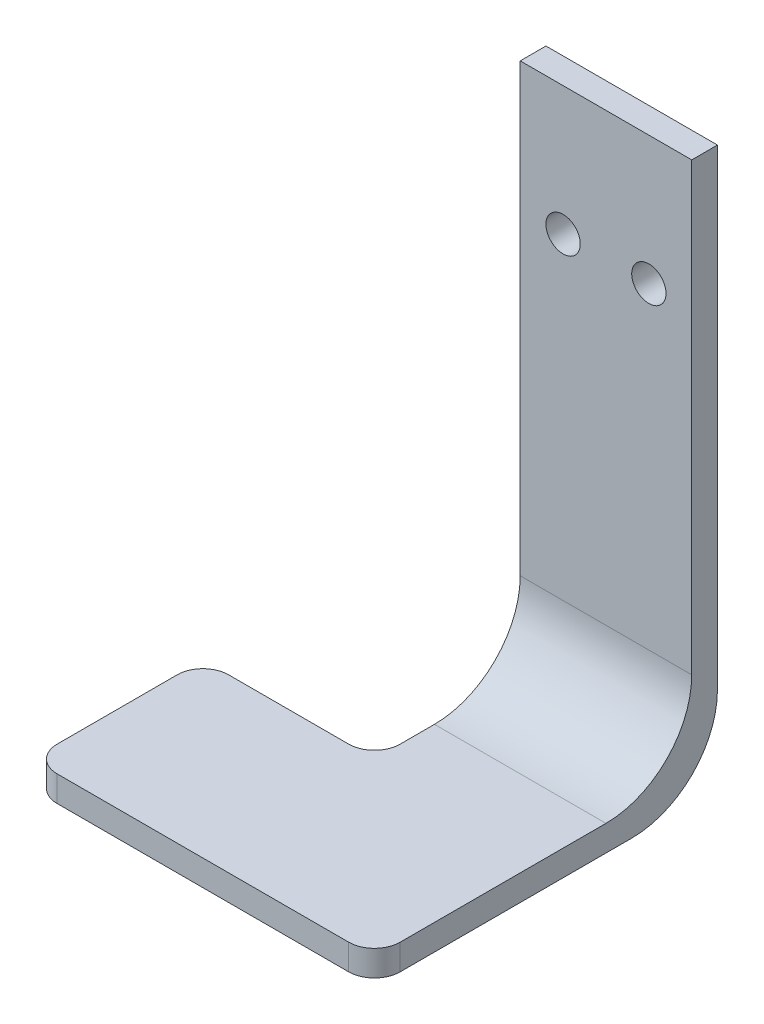
ISO-10303-21;
HEADER;
FILE_DESCRIPTION(('STEP AP214'),'2;1');
FILE_NAME('part.step','',(''),(''),'','','');
FILE_SCHEMA(('AUTOMOTIVE_DESIGN { 1 0 10303 214 1 1 1 1 }'));
ENDSEC;
DATA;
#1=APPLICATION_CONTEXT('core data for automotive mechanical design processes');
#2=APPLICATION_PROTOCOL_DEFINITION('international standard','automotive_design',2000,#1);
#3=PRODUCT_CONTEXT('',#1,'mechanical');
#4=PRODUCT('Part','Part','',(#3));
#5=PRODUCT_RELATED_PRODUCT_CATEGORY('part','',(#4));
#6=PRODUCT_DEFINITION_FORMATION('','',#4);
#7=PRODUCT_DEFINITION_CONTEXT('part definition',#1,'design');
#8=PRODUCT_DEFINITION('design','',#6,#7);
#9=PRODUCT_DEFINITION_SHAPE('','',#8);
#10=(LENGTH_UNIT() NAMED_UNIT(*) SI_UNIT(.MILLI.,.METRE.));
#11=(NAMED_UNIT(*) PLANE_ANGLE_UNIT() SI_UNIT($,.RADIAN.));
#12=(NAMED_UNIT(*) SI_UNIT($,.STERADIAN.) SOLID_ANGLE_UNIT());
#13=UNCERTAINTY_MEASURE_WITH_UNIT(LENGTH_MEASURE(1.E-05),#10,'distance_accuracy_value','');
#14=(GEOMETRIC_REPRESENTATION_CONTEXT(3) GLOBAL_UNCERTAINTY_ASSIGNED_CONTEXT((#13)) GLOBAL_UNIT_ASSIGNED_CONTEXT((#10,
#11,#12)) REPRESENTATION_CONTEXT('',''));
#15=CARTESIAN_POINT('',(0.,0.,0.));
#16=DIRECTION('',(0.,0.,1.));
#17=DIRECTION('',(1.,0.,0.));
#18=AXIS2_PLACEMENT_3D('',#15,#16,#17);
#19=CARTESIAN_POINT('',(0.,0.,3.));
#20=DIRECTION('',(0.,0.,1.));
#21=DIRECTION('',(1.,0.,0.));
#22=AXIS2_PLACEMENT_3D('',#19,#20,#21);
#23=PLANE('',#22);
#24=CARTESIAN_POINT('',(-5.,-15.,3.));
#25=DIRECTION('',(0.,0.,1.));
#26=DIRECTION('',(1.,0.,0.));
#27=AXIS2_PLACEMENT_3D('',#24,#25,#26);
#28=CIRCLE('',#27,2.);
#29=CARTESIAN_POINT('',(-3.,-15.,3.));
#30=VERTEX_POINT('',#29);
#31=EDGE_CURVE('E171',#30,#30,#28,.T.);
#32=ORIENTED_EDGE('',*,*,#31,.F.);
#33=EDGE_LOOP('',(#32));
#34=FACE_BOUND('',#33,.T.);
#35=CARTESIAN_POINT('',(5.,-15.,3.));
#36=DIRECTION('',(0.,0.,1.));
#37=DIRECTION('',(1.,0.,0.));
#38=AXIS2_PLACEMENT_3D('',#35,#36,#37);
#39=CIRCLE('',#38,2.);
#40=CARTESIAN_POINT('',(7.,-15.,3.));
#41=VERTEX_POINT('',#40);
#42=EDGE_CURVE('E265',#41,#41,#39,.T.);
#43=ORIENTED_EDGE('',*,*,#42,.F.);
#44=EDGE_LOOP('',(#43));
#45=FACE_BOUND('',#44,.T.);
#46=DIRECTION('',(0.,-1.,0.));
#47=VECTOR('',#46,1.);
#48=CARTESIAN_POINT('',(-10.,0.,3.));
#49=LINE('',#48,#47);
#50=CARTESIAN_POINT('',(-10.,0.,3.));
#51=VERTEX_POINT('',#50);
#52=CARTESIAN_POINT('',(-9.99999999999999,-52.,3.));
#53=VERTEX_POINT('',#52);
#54=EDGE_CURVE('E148',#51,#53,#49,.T.);
#55=ORIENTED_EDGE('',*,*,#54,.T.);
#56=DIRECTION('',(1.,0.,0.));
#57=VECTOR('',#56,1.);
#58=CARTESIAN_POINT('',(0.,-52.,3.));
#59=LINE('',#58,#57);
#60=CARTESIAN_POINT('',(10.,-52.,3.));
#61=VERTEX_POINT('',#60);
#62=EDGE_CURVE('E145',#53,#61,#59,.T.);
#63=ORIENTED_EDGE('',*,*,#62,.T.);
#64=DIRECTION('',(0.,1.,0.));
#65=VECTOR('',#64,1.);
#66=CARTESIAN_POINT('',(10.,0.,3.));
#67=LINE('',#66,#65);
#68=CARTESIAN_POINT('',(10.,0.,3.));
#69=VERTEX_POINT('',#68);
#70=EDGE_CURVE('E138',#61,#69,#67,.T.);
#71=ORIENTED_EDGE('',*,*,#70,.T.);
#72=DIRECTION('',(-1.,0.,0.));
#73=VECTOR('',#72,1.);
#74=CARTESIAN_POINT('',(-10.,0.,3.));
#75=LINE('',#74,#73);
#76=EDGE_CURVE('E142',#69,#51,#75,.T.);
#77=ORIENTED_EDGE('',*,*,#76,.T.);
#78=EDGE_LOOP('',(#55,#63,#71,#77));
#79=FACE_BOUND('',#78,.T.);
#80=ADVANCED_FACE('F35',(#34,#45,#79),#23,.T.);
#81=CARTESIAN_POINT('',(-10.,0.,3.));
#82=DIRECTION('',(1.,0.,0.));
#83=DIRECTION('',(0.,1.,0.));
#84=AXIS2_PLACEMENT_3D('',#81,#82,#83);
#85=PLANE('',#84);
#86=DIRECTION('',(0.,0.,-1.));
#87=VECTOR('',#86,1.);
#88=CARTESIAN_POINT('',(-9.99999999999999,-65.,0.));
#89=LINE('',#88,#87);
#90=CARTESIAN_POINT('',(-9.99999999999998,-65.,17.));
#91=VERTEX_POINT('',#90);
#92=CARTESIAN_POINT('',(-9.99999999999999,-65.,10.));
#93=VERTEX_POINT('',#92);
#94=EDGE_CURVE('E242',#91,#93,#89,.T.);
#95=ORIENTED_EDGE('',*,*,#94,.F.);
#96=DIRECTION('',(0.,1.,0.));
#97=VECTOR('',#96,1.);
#98=CARTESIAN_POINT('',(-9.99999999999999,-62.,17.));
#99=LINE('',#98,#97);
#100=CARTESIAN_POINT('',(-9.99999999999998,-62.,17.));
#101=VERTEX_POINT('',#100);
#102=EDGE_CURVE('E220',#91,#101,#99,.T.);
#103=ORIENTED_EDGE('',*,*,#102,.T.);
#104=DIRECTION('',(0.,0.,-1.));
#105=VECTOR('',#104,1.);
#106=CARTESIAN_POINT('',(-9.99999999999999,-62.,0.));
#107=LINE('',#106,#105);
#108=CARTESIAN_POINT('',(-9.99999999999999,-62.,13.));
#109=VERTEX_POINT('',#108);
#110=EDGE_CURVE('E228',#101,#109,#107,.T.);
#111=ORIENTED_EDGE('',*,*,#110,.T.);
#112=CARTESIAN_POINT('',(-9.99999999999999,-52.,13.));
#113=DIRECTION('',(1.,0.,0.));
#114=DIRECTION('',(0.,1.,0.));
#115=AXIS2_PLACEMENT_3D('',#112,#113,#114);
#116=CIRCLE('',#115,10.);
#117=EDGE_CURVE('E192',#109,#53,#116,.T.);
#118=ORIENTED_EDGE('',*,*,#117,.T.);
#119=ORIENTED_EDGE('',*,*,#54,.F.);
#120=DIRECTION('',(0.,0.,-1.));
#121=VECTOR('',#120,1.);
#122=CARTESIAN_POINT('',(-10.,0.,3.));
#123=LINE('',#122,#121);
#124=CARTESIAN_POINT('',(-10.,0.,0.));
#125=VERTEX_POINT('',#124);
#126=EDGE_CURVE('E159',#51,#125,#123,.T.);
#127=ORIENTED_EDGE('',*,*,#126,.T.);
#128=DIRECTION('',(0.,-1.,0.));
#129=VECTOR('',#128,1.);
#130=CARTESIAN_POINT('',(-10.,0.,0.));
#131=LINE('',#130,#129);
#132=CARTESIAN_POINT('',(-9.99999999999999,-55.,0.));
#133=VERTEX_POINT('',#132);
#134=EDGE_CURVE('E168',#125,#133,#131,.T.);
#135=ORIENTED_EDGE('',*,*,#134,.T.);
#136=CARTESIAN_POINT('',(-9.99999999999999,-55.,10.));
#137=DIRECTION('',(1.,0.,0.));
#138=DIRECTION('',(0.,1.,0.));
#139=AXIS2_PLACEMENT_3D('',#136,#137,#138);
#140=CIRCLE('',#139,10.);
#141=EDGE_CURVE('E183',#133,#93,#140,.F.);
#142=ORIENTED_EDGE('',*,*,#141,.T.);
#143=EDGE_LOOP('',(#95,#103,#111,#118,#119,#127,#135,#142));
#144=FACE_BOUND('',#143,.T.);
#145=ADVANCED_FACE('F245',(#144),#85,.F.);
#146=CARTESIAN_POINT('',(0.,0.,0.));
#147=DIRECTION('',(0.,0.,1.));
#148=DIRECTION('',(1.,0.,0.));
#149=AXIS2_PLACEMENT_3D('',#146,#147,#148);
#150=PLANE('',#149);
#151=DIRECTION('',(0.,1.,0.));
#152=VECTOR('',#151,1.);
#153=CARTESIAN_POINT('',(10.,0.,0.));
#154=LINE('',#153,#152);
#155=CARTESIAN_POINT('',(10.,-55.,0.));
#156=VERTEX_POINT('',#155);
#157=CARTESIAN_POINT('',(10.,0.,0.));
#158=VERTEX_POINT('',#157);
#159=EDGE_CURVE('E155',#156,#158,#154,.T.);
#160=ORIENTED_EDGE('',*,*,#159,.F.);
#161=DIRECTION('',(1.,0.,0.));
#162=VECTOR('',#161,1.);
#163=CARTESIAN_POINT('',(0.,-55.,0.));
#164=LINE('',#163,#162);
#165=EDGE_CURVE('E181',#156,#133,#164,.F.);
#166=ORIENTED_EDGE('',*,*,#165,.T.);
#167=ORIENTED_EDGE('',*,*,#134,.F.);
#168=DIRECTION('',(-1.,0.,0.));
#169=VECTOR('',#168,1.);
#170=CARTESIAN_POINT('',(-10.,0.,0.));
#171=LINE('',#170,#169);
#172=EDGE_CURVE('E173',#158,#125,#171,.T.);
#173=ORIENTED_EDGE('',*,*,#172,.F.);
#174=EDGE_LOOP('',(#160,#166,#167,#173));
#175=FACE_BOUND('',#174,.T.);
#176=CARTESIAN_POINT('',(5.,-15.,0.));
#177=DIRECTION('',(0.,0.,1.));
#178=DIRECTION('',(1.,0.,0.));
#179=AXIS2_PLACEMENT_3D('',#176,#177,#178);
#180=CIRCLE('',#179,2.);
#181=CARTESIAN_POINT('',(7.,-15.,0.));
#182=VERTEX_POINT('',#181);
#183=EDGE_CURVE('E264',#182,#182,#180,.T.);
#184=ORIENTED_EDGE('',*,*,#183,.T.);
#185=EDGE_LOOP('',(#184));
#186=FACE_BOUND('',#185,.T.);
#187=CARTESIAN_POINT('',(-5.,-15.,0.));
#188=DIRECTION('',(0.,0.,1.));
#189=DIRECTION('',(1.,0.,0.));
#190=AXIS2_PLACEMENT_3D('',#187,#188,#189);
#191=CIRCLE('',#190,2.);
#192=CARTESIAN_POINT('',(-3.,-15.,0.));
#193=VERTEX_POINT('',#192);
#194=EDGE_CURVE('E268',#193,#193,#191,.T.);
#195=ORIENTED_EDGE('',*,*,#194,.T.);
#196=EDGE_LOOP('',(#195));
#197=FACE_BOUND('',#196,.T.);
#198=ADVANCED_FACE('F310',(#175,#186,#197),#150,.F.);
#199=CARTESIAN_POINT('',(-9.99999999999999,-65.,3.));
#200=DIRECTION('',(0.,1.,0.));
#201=DIRECTION('',(0.,0.,1.));
#202=AXIS2_PLACEMENT_3D('',#199,#200,#201);
#203=PLANE('',#202);
#204=DIRECTION('',(0.,0.,-1.));
#205=VECTOR('',#204,1.);
#206=CARTESIAN_POINT('',(-30.,-65.,40.));
#207=LINE('',#206,#205);
#208=CARTESIAN_POINT('',(-30.,-65.,37.));
#209=VERTEX_POINT('',#208);
#210=CARTESIAN_POINT('',(-30.,-65.,23.));
#211=VERTEX_POINT('',#210);
#212=EDGE_CURVE('E262',#209,#211,#207,.T.);
#213=ORIENTED_EDGE('',*,*,#212,.T.);
#214=CARTESIAN_POINT('',(-27.,-65.,23.));
#215=DIRECTION('',(0.,1.,0.));
#216=DIRECTION('',(0.,0.,1.));
#217=AXIS2_PLACEMENT_3D('',#214,#215,#216);
#218=CIRCLE('',#217,3.);
#219=CARTESIAN_POINT('',(-27.,-65.,20.));
#220=VERTEX_POINT('',#219);
#221=EDGE_CURVE('E211',#211,#220,#218,.F.);
#222=ORIENTED_EDGE('',*,*,#221,.T.);
#223=DIRECTION('',(1.,0.,0.));
#224=VECTOR('',#223,1.);
#225=CARTESIAN_POINT('',(-30.,-65.,20.));
#226=LINE('',#225,#224);
#227=CARTESIAN_POINT('',(-13.,-65.,20.));
#228=VERTEX_POINT('',#227);
#229=EDGE_CURVE('E243',#220,#228,#226,.T.);
#230=ORIENTED_EDGE('',*,*,#229,.T.);
#231=CARTESIAN_POINT('',(-13.,-65.,17.));
#232=DIRECTION('',(0.,1.,0.));
#233=DIRECTION('',(0.,0.,1.));
#234=AXIS2_PLACEMENT_3D('',#231,#232,#233);
#235=CIRCLE('',#234,3.);
#236=EDGE_CURVE('E11',#228,#91,#235,.T.);
#237=ORIENTED_EDGE('',*,*,#236,.T.);
#238=ORIENTED_EDGE('',*,*,#94,.T.);
#239=DIRECTION('',(1.,0.,0.));
#240=VECTOR('',#239,1.);
#241=CARTESIAN_POINT('',(-9.99999999999999,-65.,10.));
#242=LINE('',#241,#240);
#243=CARTESIAN_POINT('',(10.,-65.,10.));
#244=VERTEX_POINT('',#243);
#245=EDGE_CURVE('E176',#93,#244,#242,.T.);
#246=ORIENTED_EDGE('',*,*,#245,.T.);
#247=DIRECTION('',(0.,0.,-1.));
#248=VECTOR('',#247,1.);
#249=CARTESIAN_POINT('',(10.,-65.,3.));
#250=LINE('',#249,#248);
#251=CARTESIAN_POINT('',(10.,-65.,37.));
#252=VERTEX_POINT('',#251);
#253=EDGE_CURVE('E158',#252,#244,#250,.T.);
#254=ORIENTED_EDGE('',*,*,#253,.F.);
#255=CARTESIAN_POINT('',(7.00000000000001,-65.,37.));
#256=DIRECTION('',(0.,1.,0.));
#257=DIRECTION('',(0.,0.,1.));
#258=AXIS2_PLACEMENT_3D('',#255,#256,#257);
#259=CIRCLE('',#258,3.);
#260=CARTESIAN_POINT('',(7.00000000000001,-65.,40.));
#261=VERTEX_POINT('',#260);
#262=EDGE_CURVE('E50',#252,#261,#259,.F.);
#263=ORIENTED_EDGE('',*,*,#262,.T.);
#264=DIRECTION('',(1.,0.,0.));
#265=VECTOR('',#264,1.);
#266=CARTESIAN_POINT('',(-30.,-65.,40.));
#267=LINE('',#266,#265);
#268=CARTESIAN_POINT('',(-27.,-65.,40.));
#269=VERTEX_POINT('',#268);
#270=EDGE_CURVE('E248',#269,#261,#267,.T.);
#271=ORIENTED_EDGE('',*,*,#270,.F.);
#272=CARTESIAN_POINT('',(-27.,-65.,37.));
#273=DIRECTION('',(0.,1.,0.));
#274=DIRECTION('',(0.,0.,1.));
#275=AXIS2_PLACEMENT_3D('',#272,#273,#274);
#276=CIRCLE('',#275,3.);
#277=EDGE_CURVE('E58',#269,#209,#276,.F.);
#278=ORIENTED_EDGE('',*,*,#277,.T.);
#279=EDGE_LOOP('',(#213,#222,#230,#237,#238,#246,#254,#263,#271,#278));
#280=FACE_BOUND('',#279,.T.);
#281=ADVANCED_FACE('F241',(#280),#203,.F.);
#282=CARTESIAN_POINT('',(10.,0.,3.));
#283=DIRECTION('',(-1.,0.,0.));
#284=DIRECTION('',(0.,-1.,0.));
#285=AXIS2_PLACEMENT_3D('',#282,#283,#284);
#286=PLANE('',#285);
#287=DIRECTION('',(0.,0.,-1.));
#288=VECTOR('',#287,1.);
#289=CARTESIAN_POINT('',(10.,-62.,40.));
#290=LINE('',#289,#288);
#291=CARTESIAN_POINT('',(10.,-62.,37.));
#292=VERTEX_POINT('',#291);
#293=CARTESIAN_POINT('',(10.,-62.,13.));
#294=VERTEX_POINT('',#293);
#295=EDGE_CURVE('E260',#292,#294,#290,.T.);
#296=ORIENTED_EDGE('',*,*,#295,.F.);
#297=DIRECTION('',(0.,1.,0.));
#298=VECTOR('',#297,1.);
#299=CARTESIAN_POINT('',(10.,0.,37.));
#300=LINE('',#299,#298);
#301=EDGE_CURVE('E218',#292,#252,#300,.F.);
#302=ORIENTED_EDGE('',*,*,#301,.T.);
#303=ORIENTED_EDGE('',*,*,#253,.T.);
#304=CARTESIAN_POINT('',(10.,-55.,10.));
#305=DIRECTION('',(-1.,0.,0.));
#306=DIRECTION('',(0.,-1.,0.));
#307=AXIS2_PLACEMENT_3D('',#304,#305,#306);
#308=CIRCLE('',#307,10.);
#309=EDGE_CURVE('E179',#244,#156,#308,.F.);
#310=ORIENTED_EDGE('',*,*,#309,.T.);
#311=ORIENTED_EDGE('',*,*,#159,.T.);
#312=DIRECTION('',(0.,0.,-1.));
#313=VECTOR('',#312,1.);
#314=CARTESIAN_POINT('',(10.,0.,3.));
#315=LINE('',#314,#313);
#316=EDGE_CURVE('E151',#69,#158,#315,.T.);
#317=ORIENTED_EDGE('',*,*,#316,.F.);
#318=ORIENTED_EDGE('',*,*,#70,.F.);
#319=CARTESIAN_POINT('',(10.,-52.,13.));
#320=DIRECTION('',(-1.,0.,0.));
#321=DIRECTION('',(0.,-1.,0.));
#322=AXIS2_PLACEMENT_3D('',#319,#320,#321);
#323=CIRCLE('',#322,10.);
#324=EDGE_CURVE('E190',#61,#294,#323,.T.);
#325=ORIENTED_EDGE('',*,*,#324,.T.);
#326=EDGE_LOOP('',(#296,#302,#303,#310,#311,#317,#318,#325));
#327=FACE_BOUND('',#326,.T.);
#328=ADVANCED_FACE('F153',(#327),#286,.F.);
#329=CARTESIAN_POINT('',(-10.,0.,3.));
#330=DIRECTION('',(0.,-1.,0.));
#331=DIRECTION('',(1.,0.,0.));
#332=AXIS2_PLACEMENT_3D('',#329,#330,#331);
#333=PLANE('',#332);
#334=ORIENTED_EDGE('',*,*,#172,.T.);
#335=ORIENTED_EDGE('',*,*,#126,.F.);
#336=ORIENTED_EDGE('',*,*,#76,.F.);
#337=ORIENTED_EDGE('',*,*,#316,.T.);
#338=EDGE_LOOP('',(#334,#335,#336,#337));
#339=FACE_BOUND('',#338,.T.);
#340=ADVANCED_FACE('F161',(#339),#333,.F.);
#341=CARTESIAN_POINT('',(-5.,-15.,3.));
#342=DIRECTION('',(0.,0.,-1.));
#343=DIRECTION('',(-1.,0.,0.));
#344=AXIS2_PLACEMENT_3D('',#341,#342,#343);
#345=CYLINDRICAL_SURFACE('',#344,2.);
#346=ORIENTED_EDGE('',*,*,#31,.T.);
#347=EDGE_LOOP('',(#346));
#348=FACE_BOUND('',#347,.T.);
#349=ORIENTED_EDGE('',*,*,#194,.F.);
#350=EDGE_LOOP('',(#349));
#351=FACE_BOUND('',#350,.T.);
#352=ADVANCED_FACE('F316',(#348,#351),#345,.F.);
#353=CARTESIAN_POINT('',(5.,-15.,3.));
#354=DIRECTION('',(0.,0.,-1.));
#355=DIRECTION('',(-1.,0.,0.));
#356=AXIS2_PLACEMENT_3D('',#353,#354,#355);
#357=CYLINDRICAL_SURFACE('',#356,2.);
#358=ORIENTED_EDGE('',*,*,#42,.T.);
#359=EDGE_LOOP('',(#358));
#360=FACE_BOUND('',#359,.T.);
#361=ORIENTED_EDGE('',*,*,#183,.F.);
#362=EDGE_LOOP('',(#361));
#363=FACE_BOUND('',#362,.T.);
#364=ADVANCED_FACE('F342',(#360,#363),#357,.F.);
#365=CARTESIAN_POINT('',(-30.,-65.,40.));
#366=DIRECTION('',(1.,0.,0.));
#367=DIRECTION('',(0.,0.,-1.));
#368=AXIS2_PLACEMENT_3D('',#365,#366,#367);
#369=PLANE('',#368);
#370=DIRECTION('',(0.,0.,-1.));
#371=VECTOR('',#370,1.);
#372=CARTESIAN_POINT('',(-30.,-62.,40.));
#373=LINE('',#372,#371);
#374=CARTESIAN_POINT('',(-30.,-62.,37.));
#375=VERTEX_POINT('',#374);
#376=CARTESIAN_POINT('',(-30.,-62.,23.));
#377=VERTEX_POINT('',#376);
#378=EDGE_CURVE('E257',#375,#377,#373,.T.);
#379=ORIENTED_EDGE('',*,*,#378,.T.);
#380=DIRECTION('',(0.,1.,0.));
#381=VECTOR('',#380,1.);
#382=CARTESIAN_POINT('',(-30.,-65.,23.));
#383=LINE('',#382,#381);
#384=EDGE_CURVE('E207',#377,#211,#383,.F.);
#385=ORIENTED_EDGE('',*,*,#384,.T.);
#386=ORIENTED_EDGE('',*,*,#212,.F.);
#387=DIRECTION('',(0.,-1.,0.));
#388=VECTOR('',#387,1.);
#389=CARTESIAN_POINT('',(-30.,-65.,37.));
#390=LINE('',#389,#388);
#391=EDGE_CURVE('E205',#209,#375,#390,.F.);
#392=ORIENTED_EDGE('',*,*,#391,.T.);
#393=EDGE_LOOP('',(#379,#385,#386,#392));
#394=FACE_BOUND('',#393,.T.);
#395=ADVANCED_FACE('F291',(#394),#369,.F.);
#396=CARTESIAN_POINT('',(-30.,-62.,40.));
#397=DIRECTION('',(0.,-1.,0.));
#398=DIRECTION('',(0.,0.,-1.));
#399=AXIS2_PLACEMENT_3D('',#396,#397,#398);
#400=PLANE('',#399);
#401=DIRECTION('',(1.,0.,0.));
#402=VECTOR('',#401,1.);
#403=CARTESIAN_POINT('',(-30.,-62.,20.));
#404=LINE('',#403,#402);
#405=CARTESIAN_POINT('',(-27.,-62.,20.));
#406=VERTEX_POINT('',#405);
#407=CARTESIAN_POINT('',(-13.,-62.,20.));
#408=VERTEX_POINT('',#407);
#409=EDGE_CURVE('E227',#406,#408,#404,.T.);
#410=ORIENTED_EDGE('',*,*,#409,.F.);
#411=CARTESIAN_POINT('',(-27.,-62.,23.));
#412=DIRECTION('',(0.,-1.,0.));
#413=DIRECTION('',(0.,0.,-1.));
#414=AXIS2_PLACEMENT_3D('',#411,#412,#413);
#415=CIRCLE('',#414,3.);
#416=EDGE_CURVE('E203',#406,#377,#415,.F.);
#417=ORIENTED_EDGE('',*,*,#416,.T.);
#418=ORIENTED_EDGE('',*,*,#378,.F.);
#419=CARTESIAN_POINT('',(-27.,-62.,37.));
#420=DIRECTION('',(0.,-1.,0.));
#421=DIRECTION('',(0.,0.,-1.));
#422=AXIS2_PLACEMENT_3D('',#419,#420,#421);
#423=CIRCLE('',#422,3.);
#424=CARTESIAN_POINT('',(-27.,-62.,40.));
#425=VERTEX_POINT('',#424);
#426=EDGE_CURVE('E201',#375,#425,#423,.F.);
#427=ORIENTED_EDGE('',*,*,#426,.T.);
#428=DIRECTION('',(-1.,0.,0.));
#429=VECTOR('',#428,1.);
#430=CARTESIAN_POINT('',(-30.,-62.,40.));
#431=LINE('',#430,#429);
#432=CARTESIAN_POINT('',(7.00000000000001,-62.,40.));
#433=VERTEX_POINT('',#432);
#434=EDGE_CURVE('E250',#433,#425,#431,.T.);
#435=ORIENTED_EDGE('',*,*,#434,.F.);
#436=CARTESIAN_POINT('',(7.00000000000001,-62.,37.));
#437=DIRECTION('',(0.,-1.,0.));
#438=DIRECTION('',(0.,0.,-1.));
#439=AXIS2_PLACEMENT_3D('',#436,#437,#438);
#440=CIRCLE('',#439,3.);
#441=EDGE_CURVE('E199',#433,#292,#440,.F.);
#442=ORIENTED_EDGE('',*,*,#441,.T.);
#443=ORIENTED_EDGE('',*,*,#295,.T.);
#444=DIRECTION('',(1.,0.,0.));
#445=VECTOR('',#444,1.);
#446=CARTESIAN_POINT('',(-30.,-62.,13.));
#447=LINE('',#446,#445);
#448=EDGE_CURVE('E187',#294,#109,#447,.F.);
#449=ORIENTED_EDGE('',*,*,#448,.T.);
#450=ORIENTED_EDGE('',*,*,#110,.F.);
#451=CARTESIAN_POINT('',(-13.,-62.,17.));
#452=DIRECTION('',(0.,-1.,0.));
#453=DIRECTION('',(0.,0.,-1.));
#454=AXIS2_PLACEMENT_3D('',#451,#452,#453);
#455=CIRCLE('',#454,3.);
#456=EDGE_CURVE('E43',#101,#408,#455,.T.);
#457=ORIENTED_EDGE('',*,*,#456,.T.);
#458=EDGE_LOOP('',(#410,#417,#418,#427,#435,#442,#443,#449,#450,#457));
#459=FACE_BOUND('',#458,.T.);
#460=ADVANCED_FACE('F226',(#459),#400,.F.);
#461=CARTESIAN_POINT('',(0.,0.,40.));
#462=DIRECTION('',(0.,0.,-1.));
#463=DIRECTION('',(-1.,0.,0.));
#464=AXIS2_PLACEMENT_3D('',#461,#462,#463);
#465=PLANE('',#464);
#466=ORIENTED_EDGE('',*,*,#434,.T.);
#467=DIRECTION('',(0.,-1.,0.));
#468=VECTOR('',#467,1.);
#469=CARTESIAN_POINT('',(-27.,0.,40.));
#470=LINE('',#469,#468);
#471=EDGE_CURVE('E216',#425,#269,#470,.T.);
#472=ORIENTED_EDGE('',*,*,#471,.T.);
#473=ORIENTED_EDGE('',*,*,#270,.T.);
#474=DIRECTION('',(0.,1.,0.));
#475=VECTOR('',#474,1.);
#476=CARTESIAN_POINT('',(7.,0.,40.));
#477=LINE('',#476,#475);
#478=EDGE_CURVE('E213',#261,#433,#477,.T.);
#479=ORIENTED_EDGE('',*,*,#478,.T.);
#480=EDGE_LOOP('',(#466,#472,#473,#479));
#481=FACE_BOUND('',#480,.T.);
#482=ADVANCED_FACE('F284',(#481),#465,.F.);
#483=CARTESIAN_POINT('',(-30.,-65.,20.));
#484=DIRECTION('',(0.,0.,1.));
#485=DIRECTION('',(1.,0.,0.));
#486=AXIS2_PLACEMENT_3D('',#483,#484,#485);
#487=PLANE('',#486);
#488=ORIENTED_EDGE('',*,*,#229,.F.);
#489=DIRECTION('',(0.,1.,0.));
#490=VECTOR('',#489,1.);
#491=CARTESIAN_POINT('',(-27.,-65.,20.));
#492=LINE('',#491,#490);
#493=EDGE_CURVE('E196',#220,#406,#492,.T.);
#494=ORIENTED_EDGE('',*,*,#493,.T.);
#495=ORIENTED_EDGE('',*,*,#409,.T.);
#496=DIRECTION('',(0.,1.,0.));
#497=VECTOR('',#496,1.);
#498=CARTESIAN_POINT('',(-13.,-65.,20.));
#499=LINE('',#498,#497);
#500=EDGE_CURVE('E194',#408,#228,#499,.F.);
#501=ORIENTED_EDGE('',*,*,#500,.T.);
#502=EDGE_LOOP('',(#488,#494,#495,#501));
#503=FACE_BOUND('',#502,.T.);
#504=ADVANCED_FACE('F234',(#503),#487,.F.);
#505=CARTESIAN_POINT('',(-9.99999999999999,-55.,10.));
#506=DIRECTION('',(1.,0.,0.));
#507=DIRECTION('',(0.,0.,-1.));
#508=AXIS2_PLACEMENT_3D('',#505,#506,#507);
#509=CYLINDRICAL_SURFACE('',#508,10.);
#510=ORIENTED_EDGE('',*,*,#141,.F.);
#511=ORIENTED_EDGE('',*,*,#165,.F.);
#512=ORIENTED_EDGE('',*,*,#309,.F.);
#513=ORIENTED_EDGE('',*,*,#245,.F.);
#514=EDGE_LOOP('',(#510,#511,#512,#513));
#515=FACE_BOUND('',#514,.T.);
#516=ADVANCED_FACE('F302',(#515),#509,.T.);
#517=CARTESIAN_POINT('',(0.,-52.,13.));
#518=DIRECTION('',(1.,0.,0.));
#519=DIRECTION('',(0.,0.,-1.));
#520=AXIS2_PLACEMENT_3D('',#517,#518,#519);
#521=CYLINDRICAL_SURFACE('',#520,10.);
#522=ORIENTED_EDGE('',*,*,#117,.F.);
#523=ORIENTED_EDGE('',*,*,#448,.F.);
#524=ORIENTED_EDGE('',*,*,#324,.F.);
#525=ORIENTED_EDGE('',*,*,#62,.F.);
#526=EDGE_LOOP('',(#522,#523,#524,#525));
#527=FACE_BOUND('',#526,.T.);
#528=ADVANCED_FACE('F276',(#527),#521,.F.);
#529=CARTESIAN_POINT('',(-27.,-65.,23.));
#530=DIRECTION('',(0.,1.,0.));
#531=DIRECTION('',(0.,0.,1.));
#532=AXIS2_PLACEMENT_3D('',#529,#530,#531);
#533=CYLINDRICAL_SURFACE('',#532,3.);
#534=ORIENTED_EDGE('',*,*,#221,.F.);
#535=ORIENTED_EDGE('',*,*,#384,.F.);
#536=ORIENTED_EDGE('',*,*,#416,.F.);
#537=ORIENTED_EDGE('',*,*,#493,.F.);
#538=EDGE_LOOP('',(#534,#535,#536,#537));
#539=FACE_BOUND('',#538,.T.);
#540=ADVANCED_FACE('F294',(#539),#533,.T.);
#541=CARTESIAN_POINT('',(-27.,0.,37.));
#542=DIRECTION('',(0.,-1.,0.));
#543=DIRECTION('',(0.,0.,-1.));
#544=AXIS2_PLACEMENT_3D('',#541,#542,#543);
#545=CYLINDRICAL_SURFACE('',#544,3.);
#546=ORIENTED_EDGE('',*,*,#426,.F.);
#547=ORIENTED_EDGE('',*,*,#391,.F.);
#548=ORIENTED_EDGE('',*,*,#277,.F.);
#549=ORIENTED_EDGE('',*,*,#471,.F.);
#550=EDGE_LOOP('',(#546,#547,#548,#549));
#551=FACE_BOUND('',#550,.T.);
#552=ADVANCED_FACE('F287',(#551),#545,.T.);
#553=CARTESIAN_POINT('',(7.,0.,37.));
#554=DIRECTION('',(0.,1.,0.));
#555=DIRECTION('',(-1.,0.,0.));
#556=AXIS2_PLACEMENT_3D('',#553,#554,#555);
#557=CYLINDRICAL_SURFACE('',#556,3.);
#558=ORIENTED_EDGE('',*,*,#262,.F.);
#559=ORIENTED_EDGE('',*,*,#301,.F.);
#560=ORIENTED_EDGE('',*,*,#441,.F.);
#561=ORIENTED_EDGE('',*,*,#478,.F.);
#562=EDGE_LOOP('',(#558,#559,#560,#561));
#563=FACE_BOUND('',#562,.T.);
#564=ADVANCED_FACE('F280',(#563),#557,.T.);
#565=CARTESIAN_POINT('',(-13.,0.,17.));
#566=DIRECTION('',(0.,-1.,0.));
#567=DIRECTION('',(1.,0.,0.));
#568=AXIS2_PLACEMENT_3D('',#565,#566,#567);
#569=CYLINDRICAL_SURFACE('',#568,3.);
#570=ORIENTED_EDGE('',*,*,#236,.F.);
#571=ORIENTED_EDGE('',*,*,#500,.F.);
#572=ORIENTED_EDGE('',*,*,#456,.F.);
#573=ORIENTED_EDGE('',*,*,#102,.F.);
#574=EDGE_LOOP('',(#570,#571,#572,#573));
#575=FACE_BOUND('',#574,.T.);
#576=ADVANCED_FACE('F37',(#575),#569,.F.);
#577=CLOSED_SHELL('',(#80,#145,#198,#281,#328,#340,#352,#364,#395,#460,#482,#504,#516,#528,#540,
#552,#564,#576));
#578=MANIFOLD_SOLID_BREP('B2',#577);
#579=ADVANCED_BREP_SHAPE_REPRESENTATION('',(#18,#578),#14);
#580=SHAPE_DEFINITION_REPRESENTATION(#9,#579);
ENDSEC;
END-ISO-10303-21;
